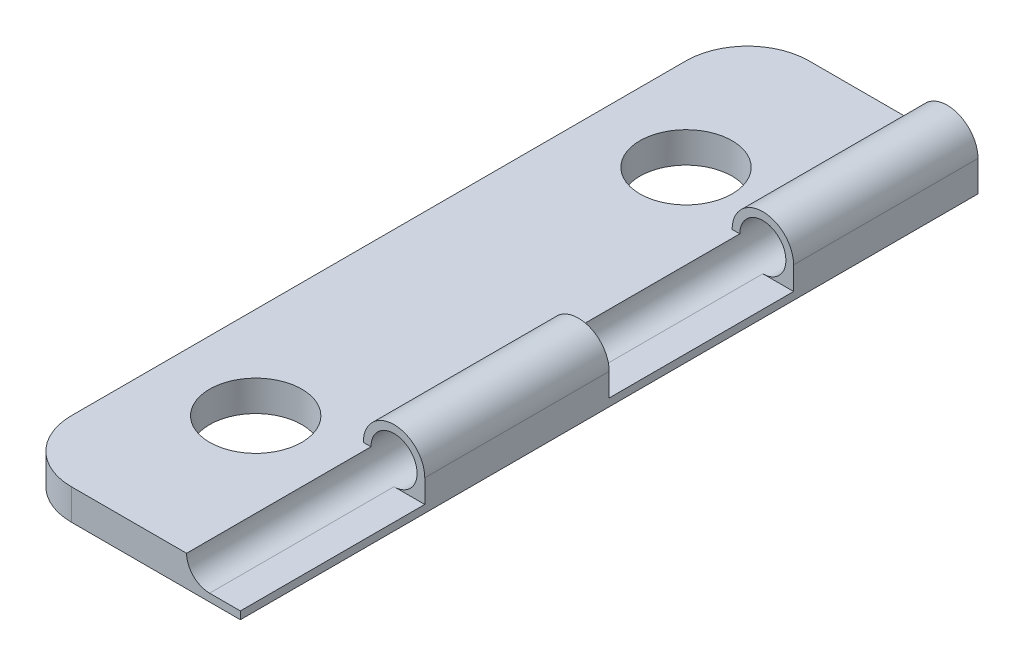
ISO-10303-21;
HEADER;
FILE_DESCRIPTION(('STEP AP214'),'2;1');
FILE_NAME('part.step','',(''),(''),'','','');
FILE_SCHEMA(('AUTOMOTIVE_DESIGN { 1 0 10303 214 1 1 1 1 }'));
ENDSEC;
DATA;
#1=APPLICATION_CONTEXT('core data for automotive mechanical design processes');
#2=APPLICATION_PROTOCOL_DEFINITION('international standard','automotive_design',2000,#1);
#3=PRODUCT_CONTEXT('',#1,'mechanical');
#4=PRODUCT('Part','Part','',(#3));
#5=PRODUCT_RELATED_PRODUCT_CATEGORY('part','',(#4));
#6=PRODUCT_DEFINITION_FORMATION('','',#4);
#7=PRODUCT_DEFINITION_CONTEXT('part definition',#1,'design');
#8=PRODUCT_DEFINITION('design','',#6,#7);
#9=PRODUCT_DEFINITION_SHAPE('','',#8);
#10=(LENGTH_UNIT() NAMED_UNIT(*) SI_UNIT(.MILLI.,.METRE.));
#11=(NAMED_UNIT(*) PLANE_ANGLE_UNIT() SI_UNIT($,.RADIAN.));
#12=(NAMED_UNIT(*) SI_UNIT($,.STERADIAN.) SOLID_ANGLE_UNIT());
#13=UNCERTAINTY_MEASURE_WITH_UNIT(LENGTH_MEASURE(1.E-05),#10,'distance_accuracy_value','');
#14=(GEOMETRIC_REPRESENTATION_CONTEXT(3) GLOBAL_UNCERTAINTY_ASSIGNED_CONTEXT((#13)) GLOBAL_UNIT_ASSIGNED_CONTEXT((#10,
#11,#12)) REPRESENTATION_CONTEXT('',''));
#15=CARTESIAN_POINT('',(0.,0.,0.));
#16=DIRECTION('',(0.,0.,1.));
#17=DIRECTION('',(1.,0.,0.));
#18=AXIS2_PLACEMENT_3D('',#15,#16,#17);
#19=CARTESIAN_POINT('',(6.49999999999999,1.,0.));
#20=DIRECTION('',(0.,0.,-1.));
#21=DIRECTION('',(-1.,0.,0.));
#22=AXIS2_PLACEMENT_3D('',#19,#20,#21);
#23=CYLINDRICAL_SURFACE('',#22,0.749999999999999);
#24=DIRECTION('',(0.,0.,1.));
#25=VECTOR('',#24,1.);
#26=CARTESIAN_POINT('',(6.49999999999999,0.25,-6.));
#27=LINE('',#26,#25);
#28=CARTESIAN_POINT('',(6.49999999999999,0.25,-6.));
#29=VERTEX_POINT('',#28);
#30=CARTESIAN_POINT('',(6.49999999999999,0.25,0.));
#31=VERTEX_POINT('',#30);
#32=EDGE_CURVE('E263',#29,#31,#27,.T.);
#33=ORIENTED_EDGE('',*,*,#32,.F.);
#34=CARTESIAN_POINT('',(6.49999999999999,1.,-6.));
#35=DIRECTION('',(0.,0.,1.));
#36=DIRECTION('',(1.,0.,0.));
#37=AXIS2_PLACEMENT_3D('',#34,#35,#36);
#38=CIRCLE('',#37,0.749999999999999);
#39=CARTESIAN_POINT('',(5.74999999999999,1.,-6.));
#40=VERTEX_POINT('',#39);
#41=EDGE_CURVE('E280',#29,#40,#38,.T.);
#42=ORIENTED_EDGE('',*,*,#41,.T.);
#43=DIRECTION('',(0.,0.,-1.));
#44=VECTOR('',#43,1.);
#45=CARTESIAN_POINT('',(5.74999999999999,1.,0.));
#46=LINE('',#45,#44);
#47=CARTESIAN_POINT('',(5.74999999999999,1.,0.));
#48=VERTEX_POINT('',#47);
#49=EDGE_CURVE('E277',#48,#40,#46,.T.);
#50=ORIENTED_EDGE('',*,*,#49,.F.);
#51=CARTESIAN_POINT('',(6.49999999999999,1.,0.));
#52=DIRECTION('',(0.,0.,-1.));
#53=DIRECTION('',(-1.,0.,0.));
#54=AXIS2_PLACEMENT_3D('',#51,#52,#53);
#55=CIRCLE('',#54,0.749999999999999);
#56=EDGE_CURVE('E266',#31,#48,#55,.T.);
#57=ORIENTED_EDGE('',*,*,#56,.F.);
#58=EDGE_LOOP('',(#33,#42,#50,#57));
#59=FACE_BOUND('',#58,.T.);
#60=CARTESIAN_POINT('',(6.49999999999999,1.,-24.));
#61=DIRECTION('',(0.,0.,-1.));
#62=DIRECTION('',(-1.,0.,0.));
#63=AXIS2_PLACEMENT_3D('',#60,#61,#62);
#64=CIRCLE('',#63,0.749999999999999);
#65=CARTESIAN_POINT('',(5.74999999999999,1.,-24.));
#66=VERTEX_POINT('',#65);
#67=EDGE_CURVE('E252',#66,#66,#64,.T.);
#68=ORIENTED_EDGE('',*,*,#67,.T.);
#69=EDGE_LOOP('',(#68));
#70=FACE_BOUND('',#69,.T.);
#71=DIRECTION('',(0.,0.,1.));
#72=VECTOR('',#71,1.);
#73=CARTESIAN_POINT('',(6.49999999999999,0.25,-18.));
#74=LINE('',#73,#72);
#75=CARTESIAN_POINT('',(6.49999999999999,0.25,-18.));
#76=VERTEX_POINT('',#75);
#77=CARTESIAN_POINT('',(6.49999999999999,0.25,-12.));
#78=VERTEX_POINT('',#77);
#79=EDGE_CURVE('E331',#76,#78,#74,.T.);
#80=ORIENTED_EDGE('',*,*,#79,.F.);
#81=CARTESIAN_POINT('',(6.49999999999999,1.,-18.));
#82=DIRECTION('',(0.,0.,-1.));
#83=DIRECTION('',(-1.,0.,0.));
#84=AXIS2_PLACEMENT_3D('',#81,#82,#83);
#85=CIRCLE('',#84,0.749999999999999);
#86=CARTESIAN_POINT('',(5.74999999999999,1.,-18.));
#87=VERTEX_POINT('',#86);
#88=EDGE_CURVE('E276',#87,#76,#85,.T.);
#89=ORIENTED_EDGE('',*,*,#88,.F.);
#90=CARTESIAN_POINT('',(5.74999999999999,1.,-12.));
#91=VERTEX_POINT('',#90);
#92=EDGE_CURVE('E269',#91,#87,#46,.T.);
#93=ORIENTED_EDGE('',*,*,#92,.F.);
#94=CARTESIAN_POINT('',(6.49999999999999,1.,-12.));
#95=DIRECTION('',(0.,0.,1.));
#96=DIRECTION('',(1.,0.,0.));
#97=AXIS2_PLACEMENT_3D('',#94,#95,#96);
#98=CIRCLE('',#97,0.749999999999999);
#99=EDGE_CURVE('E219',#78,#91,#98,.T.);
#100=ORIENTED_EDGE('',*,*,#99,.F.);
#101=EDGE_LOOP('',(#80,#89,#93,#100));
#102=FACE_BOUND('',#101,.T.);
#103=ADVANCED_FACE('F38',(#59,#70,#102),#23,.F.);
#104=CARTESIAN_POINT('',(7.49999999999999,1.,0.));
#105=DIRECTION('',(-1.,0.,0.));
#106=DIRECTION('',(0.,0.,1.));
#107=AXIS2_PLACEMENT_3D('',#104,#105,#106);
#108=PLANE('',#107);
#109=DIRECTION('',(0.,-1.,0.));
#110=VECTOR('',#109,1.);
#111=CARTESIAN_POINT('',(7.49999999999999,0.25,-18.));
#112=LINE('',#111,#110);
#113=CARTESIAN_POINT('',(7.49999999999999,1.,-18.));
#114=VERTEX_POINT('',#113);
#115=CARTESIAN_POINT('',(7.49999999999999,0.25,-18.));
#116=VERTEX_POINT('',#115);
#117=EDGE_CURVE('E150',#114,#116,#112,.T.);
#118=ORIENTED_EDGE('',*,*,#117,.T.);
#119=DIRECTION('',(0.,0.,1.));
#120=VECTOR('',#119,1.);
#121=CARTESIAN_POINT('',(7.49999999999999,0.25,-18.));
#122=LINE('',#121,#120);
#123=CARTESIAN_POINT('',(7.49999999999999,0.25,-12.));
#124=VERTEX_POINT('',#123);
#125=EDGE_CURVE('E321',#116,#124,#122,.T.);
#126=ORIENTED_EDGE('',*,*,#125,.T.);
#127=DIRECTION('',(0.,-1.,0.));
#128=VECTOR('',#127,1.);
#129=CARTESIAN_POINT('',(7.49999999999999,0.25,-12.));
#130=LINE('',#129,#128);
#131=CARTESIAN_POINT('',(7.49999999999999,1.,-12.));
#132=VERTEX_POINT('',#131);
#133=EDGE_CURVE('E320',#132,#124,#130,.T.);
#134=ORIENTED_EDGE('',*,*,#133,.F.);
#135=DIRECTION('',(0.,0.,-1.));
#136=VECTOR('',#135,1.);
#137=CARTESIAN_POINT('',(7.5,1.,-6.));
#138=LINE('',#137,#136);
#139=CARTESIAN_POINT('',(7.49999999999999,1.,-6.));
#140=VERTEX_POINT('',#139);
#141=EDGE_CURVE('E296',#140,#132,#138,.T.);
#142=ORIENTED_EDGE('',*,*,#141,.F.);
#143=DIRECTION('',(0.,1.,0.));
#144=VECTOR('',#143,1.);
#145=CARTESIAN_POINT('',(7.49999999999999,0.25,-6.));
#146=LINE('',#145,#144);
#147=CARTESIAN_POINT('',(7.49999999999999,0.25,-6.));
#148=VERTEX_POINT('',#147);
#149=EDGE_CURVE('E314',#148,#140,#146,.T.);
#150=ORIENTED_EDGE('',*,*,#149,.F.);
#151=DIRECTION('',(0.,0.,1.));
#152=VECTOR('',#151,1.);
#153=CARTESIAN_POINT('',(7.49999999999999,0.25,-6.));
#154=LINE('',#153,#152);
#155=CARTESIAN_POINT('',(7.49999999999999,0.25,0.));
#156=VERTEX_POINT('',#155);
#157=EDGE_CURVE('E260',#148,#156,#154,.T.);
#158=ORIENTED_EDGE('',*,*,#157,.T.);
#159=DIRECTION('',(0.,-1.,0.));
#160=VECTOR('',#159,1.);
#161=CARTESIAN_POINT('',(7.49999999999999,1.,0.));
#162=LINE('',#161,#160);
#163=CARTESIAN_POINT('',(7.49999999999999,0.,0.));
#164=VERTEX_POINT('',#163);
#165=EDGE_CURVE('E216',#156,#164,#162,.T.);
#166=ORIENTED_EDGE('',*,*,#165,.T.);
#167=DIRECTION('',(0.,0.,-1.));
#168=VECTOR('',#167,1.);
#169=CARTESIAN_POINT('',(7.49999999999999,0.,0.));
#170=LINE('',#169,#168);
#171=CARTESIAN_POINT('',(7.5,0.,-24.));
#172=VERTEX_POINT('',#171);
#173=EDGE_CURVE('E209',#164,#172,#170,.T.);
#174=ORIENTED_EDGE('',*,*,#173,.T.);
#175=DIRECTION('',(0.,-1.,0.));
#176=VECTOR('',#175,1.);
#177=CARTESIAN_POINT('',(7.5,1.,-24.));
#178=LINE('',#177,#176);
#179=CARTESIAN_POINT('',(7.5,1.,-24.));
#180=VERTEX_POINT('',#179);
#181=EDGE_CURVE('E167',#180,#172,#178,.T.);
#182=ORIENTED_EDGE('',*,*,#181,.F.);
#183=DIRECTION('',(0.,0.,-1.));
#184=VECTOR('',#183,1.);
#185=CARTESIAN_POINT('',(7.49999999999999,1.,-18.));
#186=LINE('',#185,#184);
#187=EDGE_CURVE('E164',#180,#114,#186,.F.);
#188=ORIENTED_EDGE('',*,*,#187,.T.);
#189=EDGE_LOOP('',(#118,#126,#134,#142,#150,#158,#166,#174,#182,#188));
#190=FACE_BOUND('',#189,.T.);
#191=ADVANCED_FACE('F165',(#190),#108,.F.);
#192=CARTESIAN_POINT('',(0.,1.,0.));
#193=DIRECTION('',(0.,-1.,0.));
#194=DIRECTION('',(0.,0.,-1.));
#195=AXIS2_PLACEMENT_3D('',#192,#193,#194);
#196=PLANE('',#195);
#197=CARTESIAN_POINT('',(3.,1.,-19.));
#198=DIRECTION('',(0.,1.,0.));
#199=DIRECTION('',(0.,0.,1.));
#200=AXIS2_PLACEMENT_3D('',#197,#198,#199);
#201=CIRCLE('',#200,1.5);
#202=CARTESIAN_POINT('',(3.,1.,-17.5));
#203=VERTEX_POINT('',#202);
#204=EDGE_CURVE('E246',#203,#203,#201,.T.);
#205=ORIENTED_EDGE('',*,*,#204,.F.);
#206=EDGE_LOOP('',(#205));
#207=FACE_BOUND('',#206,.T.);
#208=CARTESIAN_POINT('',(3.,1.,-5.));
#209=DIRECTION('',(0.,1.,0.));
#210=DIRECTION('',(0.,0.,1.));
#211=AXIS2_PLACEMENT_3D('',#208,#209,#210);
#212=CIRCLE('',#211,1.5);
#213=CARTESIAN_POINT('',(3.,1.,-3.5));
#214=VERTEX_POINT('',#213);
#215=EDGE_CURVE('E254',#214,#214,#212,.T.);
#216=ORIENTED_EDGE('',*,*,#215,.F.);
#217=EDGE_LOOP('',(#216));
#218=FACE_BOUND('',#217,.T.);
#219=DIRECTION('',(0.,0.,1.));
#220=VECTOR('',#219,1.);
#221=CARTESIAN_POINT('',(0.,1.,0.));
#222=LINE('',#221,#220);
#223=CARTESIAN_POINT('',(0.,1.,-22.));
#224=VERTEX_POINT('',#223);
#225=CARTESIAN_POINT('',(0.,1.,-2.));
#226=VERTEX_POINT('',#225);
#227=EDGE_CURVE('E192',#224,#226,#222,.T.);
#228=ORIENTED_EDGE('',*,*,#227,.T.);
#229=CARTESIAN_POINT('',(2.,1.,-2.));
#230=DIRECTION('',(0.,-1.,0.));
#231=DIRECTION('',(0.,0.,-1.));
#232=AXIS2_PLACEMENT_3D('',#229,#230,#231);
#233=CIRCLE('',#232,2.);
#234=CARTESIAN_POINT('',(2.,1.,0.));
#235=VERTEX_POINT('',#234);
#236=EDGE_CURVE('E48',#226,#235,#233,.F.);
#237=ORIENTED_EDGE('',*,*,#236,.T.);
#238=DIRECTION('',(1.,0.,0.));
#239=VECTOR('',#238,1.);
#240=CARTESIAN_POINT('',(0.,1.,0.));
#241=LINE('',#240,#239);
#242=EDGE_CURVE('E195',#235,#48,#241,.T.);
#243=ORIENTED_EDGE('',*,*,#242,.T.);
#244=ORIENTED_EDGE('',*,*,#49,.T.);
#245=DIRECTION('',(-1.,0.,0.));
#246=VECTOR('',#245,1.);
#247=CARTESIAN_POINT('',(0.,1.,-6.));
#248=LINE('',#247,#246);
#249=CARTESIAN_POINT('',(5.49999999999999,1.,-6.));
#250=VERTEX_POINT('',#249);
#251=EDGE_CURVE('E294',#40,#250,#248,.T.);
#252=ORIENTED_EDGE('',*,*,#251,.T.);
#253=DIRECTION('',(0.,0.,-1.));
#254=VECTOR('',#253,1.);
#255=CARTESIAN_POINT('',(5.49999999999999,1.,-6.));
#256=LINE('',#255,#254);
#257=CARTESIAN_POINT('',(5.49999999999999,1.,-12.));
#258=VERTEX_POINT('',#257);
#259=EDGE_CURVE('E184',#258,#250,#256,.F.);
#260=ORIENTED_EDGE('',*,*,#259,.F.);
#261=DIRECTION('',(-1.,0.,0.));
#262=VECTOR('',#261,1.);
#263=CARTESIAN_POINT('',(0.,1.,-12.));
#264=LINE('',#263,#262);
#265=EDGE_CURVE('E287',#91,#258,#264,.T.);
#266=ORIENTED_EDGE('',*,*,#265,.F.);
#267=ORIENTED_EDGE('',*,*,#92,.T.);
#268=DIRECTION('',(1.,0.,0.));
#269=VECTOR('',#268,1.);
#270=CARTESIAN_POINT('',(0.,1.,-18.));
#271=LINE('',#270,#269);
#272=CARTESIAN_POINT('',(5.49999999999999,1.,-18.));
#273=VERTEX_POINT('',#272);
#274=EDGE_CURVE('E173',#273,#87,#271,.T.);
#275=ORIENTED_EDGE('',*,*,#274,.F.);
#276=DIRECTION('',(0.,0.,-1.));
#277=VECTOR('',#276,1.);
#278=CARTESIAN_POINT('',(5.49999999999999,1.,-18.));
#279=LINE('',#278,#277);
#280=CARTESIAN_POINT('',(5.49999999999999,1.,-24.));
#281=VERTEX_POINT('',#280);
#282=EDGE_CURVE('E172',#273,#281,#279,.T.);
#283=ORIENTED_EDGE('',*,*,#282,.T.);
#284=DIRECTION('',(-1.,0.,0.));
#285=VECTOR('',#284,1.);
#286=CARTESIAN_POINT('',(0.,1.,-24.));
#287=LINE('',#286,#285);
#288=CARTESIAN_POINT('',(2.,1.,-24.));
#289=VERTEX_POINT('',#288);
#290=EDGE_CURVE('E200',#281,#289,#287,.T.);
#291=ORIENTED_EDGE('',*,*,#290,.T.);
#292=CARTESIAN_POINT('',(2.,1.,-22.));
#293=DIRECTION('',(0.,-1.,0.));
#294=DIRECTION('',(0.,0.,-1.));
#295=AXIS2_PLACEMENT_3D('',#292,#293,#294);
#296=CIRCLE('',#295,2.);
#297=EDGE_CURVE('E239',#289,#224,#296,.F.);
#298=ORIENTED_EDGE('',*,*,#297,.T.);
#299=EDGE_LOOP('',(#228,#237,#243,#244,#252,#260,#266,#267,#275,#283,#291,#298));
#300=FACE_BOUND('',#299,.T.);
#301=ADVANCED_FACE('F357',(#207,#218,#300),#196,.F.);
#302=CARTESIAN_POINT('',(0.,1.,0.));
#303=DIRECTION('',(1.,0.,0.));
#304=DIRECTION('',(0.,0.,-1.));
#305=AXIS2_PLACEMENT_3D('',#302,#303,#304);
#306=PLANE('',#305);
#307=DIRECTION('',(0.,0.,1.));
#308=VECTOR('',#307,1.);
#309=CARTESIAN_POINT('',(0.,0.,0.));
#310=LINE('',#309,#308);
#311=CARTESIAN_POINT('',(0.,0.,-22.));
#312=VERTEX_POINT('',#311);
#313=CARTESIAN_POINT('',(0.,0.,-2.));
#314=VERTEX_POINT('',#313);
#315=EDGE_CURVE('E191',#312,#314,#310,.T.);
#316=ORIENTED_EDGE('',*,*,#315,.T.);
#317=DIRECTION('',(0.,-1.,0.));
#318=VECTOR('',#317,1.);
#319=CARTESIAN_POINT('',(0.,1.,-2.));
#320=LINE('',#319,#318);
#321=EDGE_CURVE('E62',#314,#226,#320,.F.);
#322=ORIENTED_EDGE('',*,*,#321,.T.);
#323=ORIENTED_EDGE('',*,*,#227,.F.);
#324=DIRECTION('',(0.,-1.,0.));
#325=VECTOR('',#324,1.);
#326=CARTESIAN_POINT('',(0.,1.,-22.));
#327=LINE('',#326,#325);
#328=EDGE_CURVE('E233',#224,#312,#327,.T.);
#329=ORIENTED_EDGE('',*,*,#328,.T.);
#330=EDGE_LOOP('',(#316,#322,#323,#329));
#331=FACE_BOUND('',#330,.T.);
#332=ADVANCED_FACE('F367',(#331),#306,.F.);
#333=CARTESIAN_POINT('',(0.,1.,0.));
#334=DIRECTION('',(0.,0.,-1.));
#335=DIRECTION('',(-1.,0.,0.));
#336=AXIS2_PLACEMENT_3D('',#333,#334,#335);
#337=PLANE('',#336);
#338=ORIENTED_EDGE('',*,*,#165,.F.);
#339=DIRECTION('',(1.,0.,0.));
#340=VECTOR('',#339,1.);
#341=CARTESIAN_POINT('',(6.49999999999999,0.25,0.));
#342=LINE('',#341,#340);
#343=EDGE_CURVE('E337',#31,#156,#342,.T.);
#344=ORIENTED_EDGE('',*,*,#343,.F.);
#345=ORIENTED_EDGE('',*,*,#56,.T.);
#346=ORIENTED_EDGE('',*,*,#242,.F.);
#347=DIRECTION('',(0.,-1.,0.));
#348=VECTOR('',#347,1.);
#349=CARTESIAN_POINT('',(2.,1.,0.));
#350=LINE('',#349,#348);
#351=CARTESIAN_POINT('',(2.,0.,0.));
#352=VERTEX_POINT('',#351);
#353=EDGE_CURVE('E223',#235,#352,#350,.T.);
#354=ORIENTED_EDGE('',*,*,#353,.T.);
#355=DIRECTION('',(1.,0.,0.));
#356=VECTOR('',#355,1.);
#357=CARTESIAN_POINT('',(0.,0.,0.));
#358=LINE('',#357,#356);
#359=EDGE_CURVE('E205',#352,#164,#358,.T.);
#360=ORIENTED_EDGE('',*,*,#359,.T.);
#361=EDGE_LOOP('',(#338,#344,#345,#346,#354,#360));
#362=FACE_BOUND('',#361,.T.);
#363=ADVANCED_FACE('F351',(#362),#337,.F.);
#364=CARTESIAN_POINT('',(0.,1.,-24.));
#365=DIRECTION('',(0.,0.,1.));
#366=DIRECTION('',(1.,0.,0.));
#367=AXIS2_PLACEMENT_3D('',#364,#365,#366);
#368=PLANE('',#367);
#369=ORIENTED_EDGE('',*,*,#67,.F.);
#370=EDGE_LOOP('',(#369));
#371=FACE_BOUND('',#370,.T.);
#372=DIRECTION('',(-1.,0.,0.));
#373=VECTOR('',#372,1.);
#374=CARTESIAN_POINT('',(0.,0.,-24.));
#375=LINE('',#374,#373);
#376=CARTESIAN_POINT('',(2.,0.,-24.));
#377=VERTEX_POINT('',#376);
#378=EDGE_CURVE('E196',#172,#377,#375,.T.);
#379=ORIENTED_EDGE('',*,*,#378,.T.);
#380=DIRECTION('',(0.,-1.,0.));
#381=VECTOR('',#380,1.);
#382=CARTESIAN_POINT('',(2.,1.,-24.));
#383=LINE('',#382,#381);
#384=EDGE_CURVE('E11',#377,#289,#383,.F.);
#385=ORIENTED_EDGE('',*,*,#384,.T.);
#386=ORIENTED_EDGE('',*,*,#290,.F.);
#387=CARTESIAN_POINT('',(6.49999999999999,1.,-24.));
#388=DIRECTION('',(0.,0.,-1.));
#389=DIRECTION('',(-1.,0.,0.));
#390=AXIS2_PLACEMENT_3D('',#387,#388,#389);
#391=CIRCLE('',#390,1.);
#392=EDGE_CURVE('E179',#281,#180,#391,.T.);
#393=ORIENTED_EDGE('',*,*,#392,.T.);
#394=ORIENTED_EDGE('',*,*,#181,.T.);
#395=EDGE_LOOP('',(#379,#385,#386,#393,#394));
#396=FACE_BOUND('',#395,.T.);
#397=ADVANCED_FACE('F372',(#371,#396),#368,.F.);
#398=CARTESIAN_POINT('',(0.,0.,0.));
#399=DIRECTION('',(0.,-1.,0.));
#400=DIRECTION('',(0.,0.,-1.));
#401=AXIS2_PLACEMENT_3D('',#398,#399,#400);
#402=PLANE('',#401);
#403=CARTESIAN_POINT('',(3.,0.,-19.));
#404=DIRECTION('',(0.,-1.,0.));
#405=DIRECTION('',(0.,0.,-1.));
#406=AXIS2_PLACEMENT_3D('',#403,#404,#405);
#407=CIRCLE('',#406,1.5);
#408=CARTESIAN_POINT('',(3.,0.,-20.5));
#409=VERTEX_POINT('',#408);
#410=EDGE_CURVE('E42',#409,#409,#407,.T.);
#411=ORIENTED_EDGE('',*,*,#410,.F.);
#412=EDGE_LOOP('',(#411));
#413=FACE_BOUND('',#412,.T.);
#414=CARTESIAN_POINT('',(3.,0.,-5.));
#415=DIRECTION('',(0.,-1.,0.));
#416=DIRECTION('',(0.,0.,-1.));
#417=AXIS2_PLACEMENT_3D('',#414,#415,#416);
#418=CIRCLE('',#417,1.5);
#419=CARTESIAN_POINT('',(3.,0.,-6.5));
#420=VERTEX_POINT('',#419);
#421=EDGE_CURVE('E243',#420,#420,#418,.T.);
#422=ORIENTED_EDGE('',*,*,#421,.F.);
#423=EDGE_LOOP('',(#422));
#424=FACE_BOUND('',#423,.T.);
#425=ORIENTED_EDGE('',*,*,#359,.F.);
#426=CARTESIAN_POINT('',(2.,0.,-2.));
#427=DIRECTION('',(0.,-1.,0.));
#428=DIRECTION('',(0.,0.,-1.));
#429=AXIS2_PLACEMENT_3D('',#426,#427,#428);
#430=CIRCLE('',#429,2.);
#431=EDGE_CURVE('E230',#352,#314,#430,.T.);
#432=ORIENTED_EDGE('',*,*,#431,.T.);
#433=ORIENTED_EDGE('',*,*,#315,.F.);
#434=CARTESIAN_POINT('',(2.,0.,-22.));
#435=DIRECTION('',(0.,-1.,0.));
#436=DIRECTION('',(0.,0.,-1.));
#437=AXIS2_PLACEMENT_3D('',#434,#435,#436);
#438=CIRCLE('',#437,2.);
#439=EDGE_CURVE('E227',#312,#377,#438,.T.);
#440=ORIENTED_EDGE('',*,*,#439,.T.);
#441=ORIENTED_EDGE('',*,*,#378,.F.);
#442=ORIENTED_EDGE('',*,*,#173,.F.);
#443=EDGE_LOOP('',(#425,#432,#433,#440,#441,#442));
#444=FACE_BOUND('',#443,.T.);
#445=ADVANCED_FACE('F365',(#413,#424,#444),#402,.T.);
#446=CARTESIAN_POINT('',(6.49999999999999,1.,-18.));
#447=DIRECTION('',(0.,0.,-1.));
#448=DIRECTION('',(-1.,0.,0.));
#449=AXIS2_PLACEMENT_3D('',#446,#447,#448);
#450=CYLINDRICAL_SURFACE('',#449,1.);
#451=ORIENTED_EDGE('',*,*,#282,.F.);
#452=CARTESIAN_POINT('',(6.49999999999999,1.,-18.));
#453=DIRECTION('',(0.,0.,-1.));
#454=DIRECTION('',(-1.,0.,0.));
#455=AXIS2_PLACEMENT_3D('',#452,#453,#454);
#456=CIRCLE('',#455,1.);
#457=EDGE_CURVE('E155',#273,#114,#456,.T.);
#458=ORIENTED_EDGE('',*,*,#457,.T.);
#459=ORIENTED_EDGE('',*,*,#187,.F.);
#460=ORIENTED_EDGE('',*,*,#392,.F.);
#461=EDGE_LOOP('',(#451,#458,#459,#460));
#462=FACE_BOUND('',#461,.T.);
#463=ADVANCED_FACE('F176',(#462),#450,.T.);
#464=CARTESIAN_POINT('',(6.49999999999999,1.,-18.));
#465=DIRECTION('',(0.,0.,-1.));
#466=DIRECTION('',(-1.,0.,0.));
#467=AXIS2_PLACEMENT_3D('',#464,#465,#466);
#468=PLANE('',#467);
#469=ORIENTED_EDGE('',*,*,#274,.T.);
#470=ORIENTED_EDGE('',*,*,#88,.T.);
#471=DIRECTION('',(-1.,0.,0.));
#472=VECTOR('',#471,1.);
#473=CARTESIAN_POINT('',(6.49999999999999,0.25,-18.));
#474=LINE('',#473,#472);
#475=EDGE_CURVE('E157',#116,#76,#474,.T.);
#476=ORIENTED_EDGE('',*,*,#475,.F.);
#477=ORIENTED_EDGE('',*,*,#117,.F.);
#478=ORIENTED_EDGE('',*,*,#457,.F.);
#479=EDGE_LOOP('',(#469,#470,#476,#477,#478));
#480=FACE_BOUND('',#479,.T.);
#481=ADVANCED_FACE('F153',(#480),#468,.F.);
#482=CARTESIAN_POINT('',(6.5,1.,-6.));
#483=DIRECTION('',(0.,0.,-1.));
#484=DIRECTION('',(-1.,0.,0.));
#485=AXIS2_PLACEMENT_3D('',#482,#483,#484);
#486=CYLINDRICAL_SURFACE('',#485,1.);
#487=CARTESIAN_POINT('',(6.5,1.,-12.));
#488=DIRECTION('',(0.,0.,1.));
#489=DIRECTION('',(1.,0.,0.));
#490=AXIS2_PLACEMENT_3D('',#487,#488,#489);
#491=CIRCLE('',#490,1.);
#492=EDGE_CURVE('E288',#132,#258,#491,.T.);
#493=ORIENTED_EDGE('',*,*,#492,.T.);
#494=ORIENTED_EDGE('',*,*,#259,.T.);
#495=CARTESIAN_POINT('',(6.5,1.,-6.));
#496=DIRECTION('',(0.,0.,1.));
#497=DIRECTION('',(1.,0.,0.));
#498=AXIS2_PLACEMENT_3D('',#495,#496,#497);
#499=CIRCLE('',#498,1.);
#500=EDGE_CURVE('E283',#140,#250,#499,.T.);
#501=ORIENTED_EDGE('',*,*,#500,.F.);
#502=ORIENTED_EDGE('',*,*,#141,.T.);
#503=EDGE_LOOP('',(#493,#494,#501,#502));
#504=FACE_BOUND('',#503,.T.);
#505=ADVANCED_FACE('F306',(#504),#486,.T.);
#506=CARTESIAN_POINT('',(6.5,1.,-6.));
#507=DIRECTION('',(0.,0.,1.));
#508=DIRECTION('',(1.,0.,0.));
#509=AXIS2_PLACEMENT_3D('',#506,#507,#508);
#510=PLANE('',#509);
#511=ORIENTED_EDGE('',*,*,#41,.F.);
#512=DIRECTION('',(1.,0.,0.));
#513=VECTOR('',#512,1.);
#514=CARTESIAN_POINT('',(6.49999999999999,0.25,-6.));
#515=LINE('',#514,#513);
#516=EDGE_CURVE('E316',#29,#148,#515,.T.);
#517=ORIENTED_EDGE('',*,*,#516,.T.);
#518=ORIENTED_EDGE('',*,*,#149,.T.);
#519=ORIENTED_EDGE('',*,*,#500,.T.);
#520=ORIENTED_EDGE('',*,*,#251,.F.);
#521=EDGE_LOOP('',(#511,#517,#518,#519,#520));
#522=FACE_BOUND('',#521,.T.);
#523=ADVANCED_FACE('F311',(#522),#510,.T.);
#524=CARTESIAN_POINT('',(6.5,1.,-12.));
#525=DIRECTION('',(0.,0.,1.));
#526=DIRECTION('',(1.,0.,0.));
#527=AXIS2_PLACEMENT_3D('',#524,#525,#526);
#528=PLANE('',#527);
#529=ORIENTED_EDGE('',*,*,#492,.F.);
#530=ORIENTED_EDGE('',*,*,#133,.T.);
#531=DIRECTION('',(-1.,0.,0.));
#532=VECTOR('',#531,1.);
#533=CARTESIAN_POINT('',(6.49999999999999,0.25,-12.));
#534=LINE('',#533,#532);
#535=EDGE_CURVE('E161',#124,#78,#534,.T.);
#536=ORIENTED_EDGE('',*,*,#535,.T.);
#537=ORIENTED_EDGE('',*,*,#99,.T.);
#538=ORIENTED_EDGE('',*,*,#265,.T.);
#539=EDGE_LOOP('',(#529,#530,#536,#537,#538));
#540=FACE_BOUND('',#539,.T.);
#541=ADVANCED_FACE('F378',(#540),#528,.F.);
#542=CARTESIAN_POINT('',(2.,1.,-2.));
#543=DIRECTION('',(0.,-1.,0.));
#544=DIRECTION('',(0.,0.,-1.));
#545=AXIS2_PLACEMENT_3D('',#542,#543,#544);
#546=CYLINDRICAL_SURFACE('',#545,2.);
#547=ORIENTED_EDGE('',*,*,#236,.F.);
#548=ORIENTED_EDGE('',*,*,#321,.F.);
#549=ORIENTED_EDGE('',*,*,#431,.F.);
#550=ORIENTED_EDGE('',*,*,#353,.F.);
#551=EDGE_LOOP('',(#547,#548,#549,#550));
#552=FACE_BOUND('',#551,.T.);
#553=ADVANCED_FACE('F362',(#552),#546,.T.);
#554=CARTESIAN_POINT('',(2.,1.,-22.));
#555=DIRECTION('',(0.,-1.,0.));
#556=DIRECTION('',(0.,0.,-1.));
#557=AXIS2_PLACEMENT_3D('',#554,#555,#556);
#558=CYLINDRICAL_SURFACE('',#557,2.);
#559=ORIENTED_EDGE('',*,*,#297,.F.);
#560=ORIENTED_EDGE('',*,*,#384,.F.);
#561=ORIENTED_EDGE('',*,*,#439,.F.);
#562=ORIENTED_EDGE('',*,*,#328,.F.);
#563=EDGE_LOOP('',(#559,#560,#561,#562));
#564=FACE_BOUND('',#563,.T.);
#565=ADVANCED_FACE('F40',(#564),#558,.T.);
#566=CARTESIAN_POINT('',(3.,-17.,-5.));
#567=DIRECTION('',(0.,1.,0.));
#568=DIRECTION('',(0.,0.,1.));
#569=AXIS2_PLACEMENT_3D('',#566,#567,#568);
#570=CYLINDRICAL_SURFACE('',#569,1.5);
#571=ORIENTED_EDGE('',*,*,#421,.T.);
#572=EDGE_LOOP('',(#571));
#573=FACE_BOUND('',#572,.T.);
#574=ORIENTED_EDGE('',*,*,#215,.T.);
#575=EDGE_LOOP('',(#574));
#576=FACE_BOUND('',#575,.T.);
#577=ADVANCED_FACE('F396',(#573,#576),#570,.F.);
#578=CARTESIAN_POINT('',(3.,-17.,-19.));
#579=DIRECTION('',(0.,1.,0.));
#580=DIRECTION('',(0.,0.,1.));
#581=AXIS2_PLACEMENT_3D('',#578,#579,#580);
#582=CYLINDRICAL_SURFACE('',#581,1.5);
#583=ORIENTED_EDGE('',*,*,#410,.T.);
#584=EDGE_LOOP('',(#583));
#585=FACE_BOUND('',#584,.T.);
#586=ORIENTED_EDGE('',*,*,#204,.T.);
#587=EDGE_LOOP('',(#586));
#588=FACE_BOUND('',#587,.T.);
#589=ADVANCED_FACE('F399',(#585,#588),#582,.F.);
#590=CARTESIAN_POINT('',(6.49999999999999,0.25,-6.));
#591=DIRECTION('',(0.,-1.,0.));
#592=DIRECTION('',(0.,0.,-1.));
#593=AXIS2_PLACEMENT_3D('',#590,#591,#592);
#594=PLANE('',#593);
#595=ORIENTED_EDGE('',*,*,#343,.T.);
#596=ORIENTED_EDGE('',*,*,#157,.F.);
#597=ORIENTED_EDGE('',*,*,#516,.F.);
#598=ORIENTED_EDGE('',*,*,#32,.T.);
#599=EDGE_LOOP('',(#595,#596,#597,#598));
#600=FACE_BOUND('',#599,.T.);
#601=ADVANCED_FACE('F347',(#600),#594,.F.);
#602=CARTESIAN_POINT('',(6.49999999999999,0.25,-18.));
#603=DIRECTION('',(0.,1.,0.));
#604=DIRECTION('',(0.,0.,1.));
#605=AXIS2_PLACEMENT_3D('',#602,#603,#604);
#606=PLANE('',#605);
#607=ORIENTED_EDGE('',*,*,#535,.F.);
#608=ORIENTED_EDGE('',*,*,#125,.F.);
#609=ORIENTED_EDGE('',*,*,#475,.T.);
#610=ORIENTED_EDGE('',*,*,#79,.T.);
#611=EDGE_LOOP('',(#607,#608,#609,#610));
#612=FACE_BOUND('',#611,.T.);
#613=ADVANCED_FACE('F376',(#612),#606,.T.);
#614=CLOSED_SHELL('',(#103,#191,#301,#332,#363,#397,#445,#463,#481,#505,#523,#541,#553,#565,
#577,#589,#601,#613));
#615=MANIFOLD_SOLID_BREP('B2',#614);
#616=ADVANCED_BREP_SHAPE_REPRESENTATION('',(#18,#615),#14);
#617=SHAPE_DEFINITION_REPRESENTATION(#9,#616);
ENDSEC;
END-ISO-10303-21;
